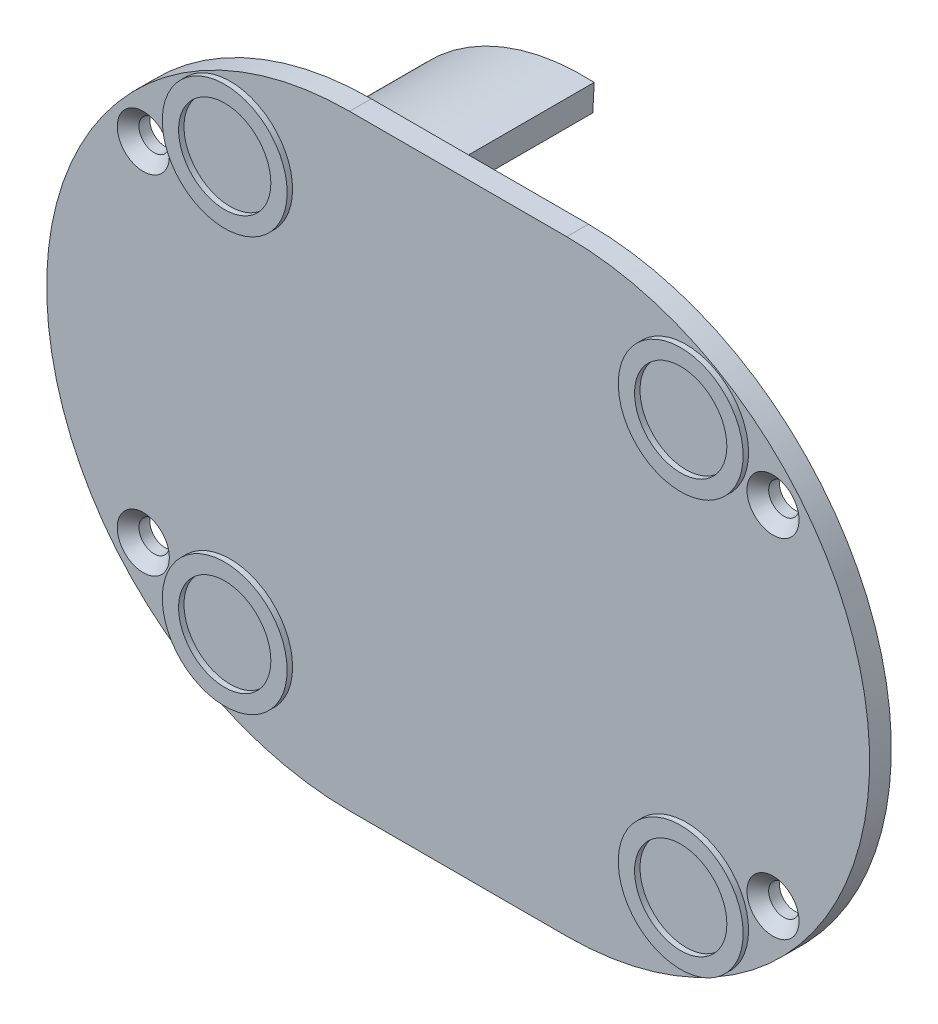
ISO-10303-21;
HEADER;
FILE_DESCRIPTION(('STEP AP214'),'2;1');
FILE_NAME('part.step','',(''),(''),'','','');
FILE_SCHEMA(('AUTOMOTIVE_DESIGN { 1 0 10303 214 1 1 1 1 }'));
ENDSEC;
DATA;
#1=APPLICATION_CONTEXT('core data for automotive mechanical design processes');
#2=APPLICATION_PROTOCOL_DEFINITION('international standard','automotive_design',2000,#1);
#3=PRODUCT_CONTEXT('',#1,'mechanical');
#4=PRODUCT('Part','Part','',(#3));
#5=PRODUCT_RELATED_PRODUCT_CATEGORY('part','',(#4));
#6=PRODUCT_DEFINITION_FORMATION('','',#4);
#7=PRODUCT_DEFINITION_CONTEXT('part definition',#1,'design');
#8=PRODUCT_DEFINITION('design','',#6,#7);
#9=PRODUCT_DEFINITION_SHAPE('','',#8);
#10=(LENGTH_UNIT() NAMED_UNIT(*) SI_UNIT(.MILLI.,.METRE.));
#11=(NAMED_UNIT(*) PLANE_ANGLE_UNIT() SI_UNIT($,.RADIAN.));
#12=(NAMED_UNIT(*) SI_UNIT($,.STERADIAN.) SOLID_ANGLE_UNIT());
#13=UNCERTAINTY_MEASURE_WITH_UNIT(LENGTH_MEASURE(1.E-05),#10,'distance_accuracy_value','');
#14=(GEOMETRIC_REPRESENTATION_CONTEXT(3) GLOBAL_UNCERTAINTY_ASSIGNED_CONTEXT((#13)) GLOBAL_UNIT_ASSIGNED_CONTEXT((#10,
#11,#12)) REPRESENTATION_CONTEXT('',''));
#15=CARTESIAN_POINT('',(0.,0.,0.));
#16=DIRECTION('',(0.,0.,1.));
#17=DIRECTION('',(1.,0.,0.));
#18=AXIS2_PLACEMENT_3D('',#15,#16,#17);
#19=CARTESIAN_POINT('',(-20.,0.,2.));
#20=DIRECTION('',(0.,0.,-1.));
#21=DIRECTION('',(-1.,0.,0.));
#22=AXIS2_PLACEMENT_3D('',#19,#20,#21);
#23=CYLINDRICAL_SURFACE('',#22,27.9);
#24=CARTESIAN_POINT('',(-20.,0.,0.));
#25=DIRECTION('',(0.,0.,1.));
#26=DIRECTION('',(1.,0.,0.));
#27=AXIS2_PLACEMENT_3D('',#24,#25,#26);
#28=CIRCLE('',#27,27.9);
#29=CARTESIAN_POINT('',(-20.,27.9,0.));
#30=VERTEX_POINT('',#29);
#31=CARTESIAN_POINT('',(-20.,-27.9,0.));
#32=VERTEX_POINT('',#31);
#33=EDGE_CURVE('E247',#30,#32,#28,.T.);
#34=ORIENTED_EDGE('',*,*,#33,.T.);
#35=DIRECTION('',(0.,0.,-1.));
#36=VECTOR('',#35,1.);
#37=CARTESIAN_POINT('',(-20.,-27.9,2.));
#38=LINE('',#37,#36);
#39=CARTESIAN_POINT('',(-20.,-27.9,2.));
#40=VERTEX_POINT('',#39);
#41=EDGE_CURVE('E263',#40,#32,#38,.T.);
#42=ORIENTED_EDGE('',*,*,#41,.F.);
#43=CARTESIAN_POINT('',(-20.,0.,2.));
#44=DIRECTION('',(0.,0.,1.));
#45=DIRECTION('',(1.,0.,0.));
#46=AXIS2_PLACEMENT_3D('',#43,#44,#45);
#47=CIRCLE('',#46,27.9);
#48=CARTESIAN_POINT('',(-20.,27.9,2.));
#49=VERTEX_POINT('',#48);
#50=EDGE_CURVE('E236',#49,#40,#47,.T.);
#51=ORIENTED_EDGE('',*,*,#50,.F.);
#52=DIRECTION('',(0.,0.,-1.));
#53=VECTOR('',#52,1.);
#54=CARTESIAN_POINT('',(-20.,27.9,2.));
#55=LINE('',#54,#53);
#56=EDGE_CURVE('E246',#49,#30,#55,.T.);
#57=ORIENTED_EDGE('',*,*,#56,.T.);
#58=EDGE_LOOP('',(#34,#42,#51,#57));
#59=FACE_BOUND('',#58,.T.);
#60=ADVANCED_FACE('F61',(#59),#23,.T.);
#61=CARTESIAN_POINT('',(-20.,-27.9,2.));
#62=DIRECTION('',(0.,1.,0.));
#63=DIRECTION('',(0.,0.,1.));
#64=AXIS2_PLACEMENT_3D('',#61,#62,#63);
#65=PLANE('',#64);
#66=DIRECTION('',(1.,0.,0.));
#67=VECTOR('',#66,1.);
#68=CARTESIAN_POINT('',(-20.,-27.9,0.));
#69=LINE('',#68,#67);
#70=CARTESIAN_POINT('',(0.,-27.9,0.));
#71=VERTEX_POINT('',#70);
#72=EDGE_CURVE('E250',#32,#71,#69,.T.);
#73=ORIENTED_EDGE('',*,*,#72,.T.);
#74=DIRECTION('',(0.,0.,-1.));
#75=VECTOR('',#74,1.);
#76=CARTESIAN_POINT('',(0.,-27.9,2.));
#77=LINE('',#76,#75);
#78=CARTESIAN_POINT('',(0.,-27.9,2.));
#79=VERTEX_POINT('',#78);
#80=EDGE_CURVE('E260',#79,#71,#77,.T.);
#81=ORIENTED_EDGE('',*,*,#80,.F.);
#82=DIRECTION('',(1.,0.,0.));
#83=VECTOR('',#82,1.);
#84=CARTESIAN_POINT('',(-20.,-27.9,2.));
#85=LINE('',#84,#83);
#86=EDGE_CURVE('E239',#40,#79,#85,.T.);
#87=ORIENTED_EDGE('',*,*,#86,.F.);
#88=ORIENTED_EDGE('',*,*,#41,.T.);
#89=EDGE_LOOP('',(#73,#81,#87,#88));
#90=FACE_BOUND('',#89,.T.);
#91=ADVANCED_FACE('F322',(#90),#65,.F.);
#92=CARTESIAN_POINT('',(0.,0.,2.));
#93=DIRECTION('',(0.,0.,-1.));
#94=DIRECTION('',(-1.,0.,0.));
#95=AXIS2_PLACEMENT_3D('',#92,#93,#94);
#96=CYLINDRICAL_SURFACE('',#95,27.9);
#97=CARTESIAN_POINT('',(0.,0.,0.));
#98=DIRECTION('',(0.,0.,1.));
#99=DIRECTION('',(1.,0.,0.));
#100=AXIS2_PLACEMENT_3D('',#97,#98,#99);
#101=CIRCLE('',#100,27.9);
#102=CARTESIAN_POINT('',(0.,27.9,0.));
#103=VERTEX_POINT('',#102);
#104=EDGE_CURVE('E252',#71,#103,#101,.T.);
#105=ORIENTED_EDGE('',*,*,#104,.T.);
#106=DIRECTION('',(0.,0.,-1.));
#107=VECTOR('',#106,1.);
#108=CARTESIAN_POINT('',(0.,27.9,2.));
#109=LINE('',#108,#107);
#110=CARTESIAN_POINT('',(0.,27.9,2.));
#111=VERTEX_POINT('',#110);
#112=EDGE_CURVE('E257',#111,#103,#109,.T.);
#113=ORIENTED_EDGE('',*,*,#112,.F.);
#114=CARTESIAN_POINT('',(0.,0.,2.));
#115=DIRECTION('',(0.,0.,1.));
#116=DIRECTION('',(1.,0.,0.));
#117=AXIS2_PLACEMENT_3D('',#114,#115,#116);
#118=CIRCLE('',#117,27.9);
#119=EDGE_CURVE('E242',#79,#111,#118,.T.);
#120=ORIENTED_EDGE('',*,*,#119,.F.);
#121=ORIENTED_EDGE('',*,*,#80,.T.);
#122=EDGE_LOOP('',(#105,#113,#120,#121));
#123=FACE_BOUND('',#122,.T.);
#124=ADVANCED_FACE('F328',(#123),#96,.T.);
#125=CARTESIAN_POINT('',(0.,27.9,2.));
#126=DIRECTION('',(0.,-1.,0.));
#127=DIRECTION('',(0.,0.,-1.));
#128=AXIS2_PLACEMENT_3D('',#125,#126,#127);
#129=PLANE('',#128);
#130=DIRECTION('',(-1.,0.,0.));
#131=VECTOR('',#130,1.);
#132=CARTESIAN_POINT('',(0.,27.9,0.));
#133=LINE('',#132,#131);
#134=EDGE_CURVE('E240',#103,#30,#133,.T.);
#135=ORIENTED_EDGE('',*,*,#134,.T.);
#136=ORIENTED_EDGE('',*,*,#56,.F.);
#137=DIRECTION('',(-1.,0.,0.));
#138=VECTOR('',#137,1.);
#139=CARTESIAN_POINT('',(0.,27.9,2.));
#140=LINE('',#139,#138);
#141=EDGE_CURVE('E244',#111,#49,#140,.T.);
#142=ORIENTED_EDGE('',*,*,#141,.F.);
#143=ORIENTED_EDGE('',*,*,#112,.T.);
#144=EDGE_LOOP('',(#135,#136,#142,#143));
#145=FACE_BOUND('',#144,.T.);
#146=ADVANCED_FACE('F594',(#145),#129,.F.);
#147=CARTESIAN_POINT('',(-20.,0.,2.));
#148=DIRECTION('',(0.,0.,1.));
#149=DIRECTION('',(1.,0.,0.));
#150=AXIS2_PLACEMENT_3D('',#147,#148,#149);
#151=PLANE('',#150);
#152=CARTESIAN_POINT('',(-31.0000000000001,19.0525588832576,2.));
#153=DIRECTION('',(0.,0.,1.));
#154=DIRECTION('',(1.,0.,0.));
#155=AXIS2_PLACEMENT_3D('',#152,#153,#154);
#156=CIRCLE('',#155,5.75);
#157=CARTESIAN_POINT('',(-25.2500000000001,19.0525588832576,2.));
#158=VERTEX_POINT('',#157);
#159=EDGE_CURVE('E184',#158,#158,#156,.T.);
#160=ORIENTED_EDGE('',*,*,#159,.F.);
#161=EDGE_LOOP('',(#160));
#162=FACE_BOUND('',#161,.T.);
#163=CARTESIAN_POINT('',(-31.0000000000001,-19.0525588832576,2.));
#164=DIRECTION('',(0.,0.,1.));
#165=DIRECTION('',(1.,0.,0.));
#166=AXIS2_PLACEMENT_3D('',#163,#164,#165);
#167=CIRCLE('',#166,5.75);
#168=CARTESIAN_POINT('',(-25.2500000000001,-19.0525588832576,2.));
#169=VERTEX_POINT('',#168);
#170=EDGE_CURVE('E175',#169,#169,#167,.T.);
#171=ORIENTED_EDGE('',*,*,#170,.F.);
#172=EDGE_LOOP('',(#171));
#173=FACE_BOUND('',#172,.T.);
#174=CARTESIAN_POINT('',(11.,19.0525588832577,2.));
#175=DIRECTION('',(0.,0.,1.));
#176=DIRECTION('',(1.,0.,0.));
#177=AXIS2_PLACEMENT_3D('',#174,#175,#176);
#178=CIRCLE('',#177,5.75);
#179=CARTESIAN_POINT('',(16.75,19.0525588832577,2.));
#180=VERTEX_POINT('',#179);
#181=EDGE_CURVE('E193',#180,#180,#178,.T.);
#182=ORIENTED_EDGE('',*,*,#181,.F.);
#183=EDGE_LOOP('',(#182));
#184=FACE_BOUND('',#183,.T.);
#185=CARTESIAN_POINT('',(11.,-19.0525588832577,2.));
#186=DIRECTION('',(0.,0.,1.));
#187=DIRECTION('',(1.,0.,0.));
#188=AXIS2_PLACEMENT_3D('',#185,#186,#187);
#189=CIRCLE('',#188,5.75);
#190=CARTESIAN_POINT('',(16.75,-19.0525588832577,2.));
#191=VERTEX_POINT('',#190);
#192=EDGE_CURVE('E202',#191,#191,#189,.T.);
#193=ORIENTED_EDGE('',*,*,#192,.F.);
#194=EDGE_LOOP('',(#193));
#195=FACE_BOUND('',#194,.T.);
#196=CARTESIAN_POINT('',(19.,-16.,2.));
#197=DIRECTION('',(0.,0.,1.));
#198=DIRECTION('',(1.,0.,0.));
#199=AXIS2_PLACEMENT_3D('',#196,#197,#198);
#200=CIRCLE('',#199,2.4);
#201=CARTESIAN_POINT('',(21.4,-16.,2.));
#202=VERTEX_POINT('',#201);
#203=EDGE_CURVE('E206',#202,#202,#200,.T.);
#204=ORIENTED_EDGE('',*,*,#203,.F.);
#205=EDGE_LOOP('',(#204));
#206=FACE_BOUND('',#205,.T.);
#207=CARTESIAN_POINT('',(19.,16.,2.));
#208=DIRECTION('',(0.,0.,1.));
#209=DIRECTION('',(1.,0.,0.));
#210=AXIS2_PLACEMENT_3D('',#207,#208,#209);
#211=CIRCLE('',#210,2.4);
#212=CARTESIAN_POINT('',(21.4,16.,2.));
#213=VERTEX_POINT('',#212);
#214=EDGE_CURVE('E215',#213,#213,#211,.T.);
#215=ORIENTED_EDGE('',*,*,#214,.F.);
#216=EDGE_LOOP('',(#215));
#217=FACE_BOUND('',#216,.T.);
#218=CARTESIAN_POINT('',(-39.,-16.,2.));
#219=DIRECTION('',(0.,0.,1.));
#220=DIRECTION('',(1.,0.,0.));
#221=AXIS2_PLACEMENT_3D('',#218,#219,#220);
#222=CIRCLE('',#221,2.4);
#223=CARTESIAN_POINT('',(-36.6,-16.,2.));
#224=VERTEX_POINT('',#223);
#225=EDGE_CURVE('E222',#224,#224,#222,.T.);
#226=ORIENTED_EDGE('',*,*,#225,.F.);
#227=EDGE_LOOP('',(#226));
#228=FACE_BOUND('',#227,.T.);
#229=CARTESIAN_POINT('',(-39.,16.,2.));
#230=DIRECTION('',(0.,0.,1.));
#231=DIRECTION('',(1.,0.,0.));
#232=AXIS2_PLACEMENT_3D('',#229,#230,#231);
#233=CIRCLE('',#232,2.4);
#234=CARTESIAN_POINT('',(-36.6,16.,2.));
#235=VERTEX_POINT('',#234);
#236=EDGE_CURVE('E229',#235,#235,#233,.T.);
#237=ORIENTED_EDGE('',*,*,#236,.F.);
#238=EDGE_LOOP('',(#237));
#239=FACE_BOUND('',#238,.T.);
#240=ORIENTED_EDGE('',*,*,#50,.T.);
#241=ORIENTED_EDGE('',*,*,#86,.T.);
#242=ORIENTED_EDGE('',*,*,#119,.T.);
#243=ORIENTED_EDGE('',*,*,#141,.T.);
#244=EDGE_LOOP('',(#240,#241,#242,#243));
#245=FACE_BOUND('',#244,.T.);
#246=ADVANCED_FACE('F389',(#162,#173,#184,#195,#206,#217,#228,#239,#245),#151,.T.);
#247=CARTESIAN_POINT('',(-20.,0.,0.));
#248=DIRECTION('',(0.,0.,1.));
#249=DIRECTION('',(1.,0.,0.));
#250=AXIS2_PLACEMENT_3D('',#247,#248,#249);
#251=PLANE('',#250);
#252=CARTESIAN_POINT('',(-20.,0.,0.));
#253=DIRECTION('',(0.,0.,1.));
#254=DIRECTION('',(1.,0.,0.));
#255=AXIS2_PLACEMENT_3D('',#252,#253,#254);
#256=CIRCLE('',#255,15.5);
#257=CARTESIAN_POINT('',(-34.6737330972949,4.99315100806604,0.));
#258=VERTEX_POINT('',#257);
#259=CARTESIAN_POINT('',(-19.2011295455593,15.4793994068575,0.));
#260=VERTEX_POINT('',#259);
#261=EDGE_CURVE('E293',#258,#260,#256,.F.);
#262=ORIENTED_EDGE('',*,*,#261,.T.);
#263=DIRECTION('',(-0.0515400293187571,-0.99867092947468,0.));
#264=VECTOR('',#263,1.);
#265=CARTESIAN_POINT('',(-20.,0.,0.));
#266=LINE('',#265,#264);
#267=CARTESIAN_POINT('',(-18.8661193549873,21.9707604484429,0.));
#268=VERTEX_POINT('',#267);
#269=EDGE_CURVE('E286',#268,#260,#266,.T.);
#270=ORIENTED_EDGE('',*,*,#269,.F.);
#271=CARTESIAN_POINT('',(-20.,0.,0.));
#272=DIRECTION('',(0.,0.,1.));
#273=DIRECTION('',(1.,0.,0.));
#274=AXIS2_PLACEMENT_3D('',#271,#272,#273);
#275=CIRCLE('',#274,22.);
#276=CARTESIAN_POINT('',(-40.8272340735799,7.08705304370663,0.));
#277=VERTEX_POINT('',#276);
#278=EDGE_CURVE('E290',#268,#277,#275,.T.);
#279=ORIENTED_EDGE('',*,*,#278,.T.);
#280=DIRECTION('',(-0.946692457889997,0.322138774713938,0.));
#281=VECTOR('',#280,1.);
#282=CARTESIAN_POINT('',(-20.,0.,0.));
#283=LINE('',#282,#281);
#284=EDGE_CURVE('E288',#258,#277,#283,.T.);
#285=ORIENTED_EDGE('',*,*,#284,.F.);
#286=EDGE_LOOP('',(#262,#270,#279,#285));
#287=FACE_BOUND('',#286,.T.);
#288=CARTESIAN_POINT('',(19.,-16.,0.));
#289=DIRECTION('',(0.,0.,1.));
#290=DIRECTION('',(1.,0.,0.));
#291=AXIS2_PLACEMENT_3D('',#288,#289,#290);
#292=CIRCLE('',#291,1.4);
#293=CARTESIAN_POINT('',(20.4,-16.,0.));
#294=VERTEX_POINT('',#293);
#295=EDGE_CURVE('E214',#294,#294,#292,.T.);
#296=ORIENTED_EDGE('',*,*,#295,.T.);
#297=EDGE_LOOP('',(#296));
#298=FACE_BOUND('',#297,.T.);
#299=CARTESIAN_POINT('',(19.,16.,0.));
#300=DIRECTION('',(0.,0.,1.));
#301=DIRECTION('',(1.,0.,0.));
#302=AXIS2_PLACEMENT_3D('',#299,#300,#301);
#303=CIRCLE('',#302,1.4);
#304=CARTESIAN_POINT('',(20.4,16.,0.));
#305=VERTEX_POINT('',#304);
#306=EDGE_CURVE('E221',#305,#305,#303,.T.);
#307=ORIENTED_EDGE('',*,*,#306,.T.);
#308=EDGE_LOOP('',(#307));
#309=FACE_BOUND('',#308,.T.);
#310=CARTESIAN_POINT('',(-39.,-16.,0.));
#311=DIRECTION('',(0.,0.,1.));
#312=DIRECTION('',(1.,0.,0.));
#313=AXIS2_PLACEMENT_3D('',#310,#311,#312);
#314=CIRCLE('',#313,1.4);
#315=CARTESIAN_POINT('',(-37.6,-16.,0.));
#316=VERTEX_POINT('',#315);
#317=EDGE_CURVE('E228',#316,#316,#314,.T.);
#318=ORIENTED_EDGE('',*,*,#317,.T.);
#319=EDGE_LOOP('',(#318));
#320=FACE_BOUND('',#319,.T.);
#321=CARTESIAN_POINT('',(-39.,16.,0.));
#322=DIRECTION('',(0.,0.,1.));
#323=DIRECTION('',(1.,0.,0.));
#324=AXIS2_PLACEMENT_3D('',#321,#322,#323);
#325=CIRCLE('',#324,1.4);
#326=CARTESIAN_POINT('',(-37.6,16.,0.));
#327=VERTEX_POINT('',#326);
#328=EDGE_CURVE('E235',#327,#327,#325,.T.);
#329=ORIENTED_EDGE('',*,*,#328,.T.);
#330=EDGE_LOOP('',(#329));
#331=FACE_BOUND('',#330,.T.);
#332=ORIENTED_EDGE('',*,*,#33,.F.);
#333=ORIENTED_EDGE('',*,*,#134,.F.);
#334=ORIENTED_EDGE('',*,*,#104,.F.);
#335=ORIENTED_EDGE('',*,*,#72,.F.);
#336=EDGE_LOOP('',(#332,#333,#334,#335));
#337=FACE_BOUND('',#336,.T.);
#338=ADVANCED_FACE('F304',(#287,#298,#309,#320,#331,#337),#251,.F.);
#339=CARTESIAN_POINT('',(-39.,16.,2.));
#340=DIRECTION('',(0.,0.,1.));
#341=DIRECTION('',(1.,0.,0.));
#342=AXIS2_PLACEMENT_3D('',#339,#340,#341);
#343=CYLINDRICAL_SURFACE('',#342,1.4);
#344=CARTESIAN_POINT('',(-39.,16.,1.));
#345=DIRECTION('',(0.,0.,1.));
#346=DIRECTION('',(1.,0.,0.));
#347=AXIS2_PLACEMENT_3D('',#344,#345,#346);
#348=CIRCLE('',#347,1.4);
#349=CARTESIAN_POINT('',(-37.6,16.,1.));
#350=VERTEX_POINT('',#349);
#351=EDGE_CURVE('E232',#350,#350,#348,.T.);
#352=ORIENTED_EDGE('',*,*,#351,.T.);
#353=EDGE_LOOP('',(#352));
#354=FACE_BOUND('',#353,.T.);
#355=ORIENTED_EDGE('',*,*,#328,.F.);
#356=EDGE_LOOP('',(#355));
#357=FACE_BOUND('',#356,.T.);
#358=ADVANCED_FACE('F388',(#354,#357),#343,.F.);
#359=CARTESIAN_POINT('',(-39.,16.,2.));
#360=DIRECTION('',(0.,0.,1.));
#361=DIRECTION('',(1.,0.,0.));
#362=AXIS2_PLACEMENT_3D('',#359,#360,#361);
#363=CONICAL_SURFACE('',#362,2.4,0.785398163397449);
#364=ORIENTED_EDGE('',*,*,#351,.F.);
#365=EDGE_LOOP('',(#364));
#366=FACE_BOUND('',#365,.T.);
#367=ORIENTED_EDGE('',*,*,#236,.T.);
#368=EDGE_LOOP('',(#367));
#369=FACE_BOUND('',#368,.T.);
#370=ADVANCED_FACE('F405',(#366,#369),#363,.F.);
#371=CARTESIAN_POINT('',(-39.,-16.,2.));
#372=DIRECTION('',(0.,0.,1.));
#373=DIRECTION('',(1.,0.,0.));
#374=AXIS2_PLACEMENT_3D('',#371,#372,#373);
#375=CYLINDRICAL_SURFACE('',#374,1.4);
#376=CARTESIAN_POINT('',(-39.,-16.,1.));
#377=DIRECTION('',(0.,0.,1.));
#378=DIRECTION('',(1.,0.,0.));
#379=AXIS2_PLACEMENT_3D('',#376,#377,#378);
#380=CIRCLE('',#379,1.4);
#381=CARTESIAN_POINT('',(-37.6,-16.,1.));
#382=VERTEX_POINT('',#381);
#383=EDGE_CURVE('E225',#382,#382,#380,.T.);
#384=ORIENTED_EDGE('',*,*,#383,.T.);
#385=EDGE_LOOP('',(#384));
#386=FACE_BOUND('',#385,.T.);
#387=ORIENTED_EDGE('',*,*,#317,.F.);
#388=EDGE_LOOP('',(#387));
#389=FACE_BOUND('',#388,.T.);
#390=ADVANCED_FACE('F413',(#386,#389),#375,.F.);
#391=CARTESIAN_POINT('',(-39.,-16.,2.));
#392=DIRECTION('',(0.,0.,1.));
#393=DIRECTION('',(1.,0.,0.));
#394=AXIS2_PLACEMENT_3D('',#391,#392,#393);
#395=CONICAL_SURFACE('',#394,2.4,0.785398163397449);
#396=ORIENTED_EDGE('',*,*,#383,.F.);
#397=EDGE_LOOP('',(#396));
#398=FACE_BOUND('',#397,.T.);
#399=ORIENTED_EDGE('',*,*,#225,.T.);
#400=EDGE_LOOP('',(#399));
#401=FACE_BOUND('',#400,.T.);
#402=ADVANCED_FACE('F421',(#398,#401),#395,.F.);
#403=CARTESIAN_POINT('',(19.,16.,2.));
#404=DIRECTION('',(0.,0.,1.));
#405=DIRECTION('',(1.,0.,0.));
#406=AXIS2_PLACEMENT_3D('',#403,#404,#405);
#407=CYLINDRICAL_SURFACE('',#406,1.4);
#408=CARTESIAN_POINT('',(19.,16.,1.));
#409=DIRECTION('',(0.,0.,1.));
#410=DIRECTION('',(1.,0.,0.));
#411=AXIS2_PLACEMENT_3D('',#408,#409,#410);
#412=CIRCLE('',#411,1.4);
#413=CARTESIAN_POINT('',(20.4,16.,1.));
#414=VERTEX_POINT('',#413);
#415=EDGE_CURVE('E218',#414,#414,#412,.T.);
#416=ORIENTED_EDGE('',*,*,#415,.T.);
#417=EDGE_LOOP('',(#416));
#418=FACE_BOUND('',#417,.T.);
#419=ORIENTED_EDGE('',*,*,#306,.F.);
#420=EDGE_LOOP('',(#419));
#421=FACE_BOUND('',#420,.T.);
#422=ADVANCED_FACE('F429',(#418,#421),#407,.F.);
#423=CARTESIAN_POINT('',(19.,16.,2.));
#424=DIRECTION('',(0.,0.,1.));
#425=DIRECTION('',(1.,0.,0.));
#426=AXIS2_PLACEMENT_3D('',#423,#424,#425);
#427=CONICAL_SURFACE('',#426,2.4,0.785398163397449);
#428=ORIENTED_EDGE('',*,*,#415,.F.);
#429=EDGE_LOOP('',(#428));
#430=FACE_BOUND('',#429,.T.);
#431=ORIENTED_EDGE('',*,*,#214,.T.);
#432=EDGE_LOOP('',(#431));
#433=FACE_BOUND('',#432,.T.);
#434=ADVANCED_FACE('F437',(#430,#433),#427,.F.);
#435=CARTESIAN_POINT('',(19.,-16.,2.));
#436=DIRECTION('',(0.,0.,1.));
#437=DIRECTION('',(1.,0.,0.));
#438=AXIS2_PLACEMENT_3D('',#435,#436,#437);
#439=CYLINDRICAL_SURFACE('',#438,1.4);
#440=CARTESIAN_POINT('',(19.,-16.,1.));
#441=DIRECTION('',(0.,0.,1.));
#442=DIRECTION('',(1.,0.,0.));
#443=AXIS2_PLACEMENT_3D('',#440,#441,#442);
#444=CIRCLE('',#443,1.4);
#445=CARTESIAN_POINT('',(20.4,-16.,1.));
#446=VERTEX_POINT('',#445);
#447=EDGE_CURVE('E211',#446,#446,#444,.T.);
#448=ORIENTED_EDGE('',*,*,#447,.T.);
#449=EDGE_LOOP('',(#448));
#450=FACE_BOUND('',#449,.T.);
#451=ORIENTED_EDGE('',*,*,#295,.F.);
#452=EDGE_LOOP('',(#451));
#453=FACE_BOUND('',#452,.T.);
#454=ADVANCED_FACE('F445',(#450,#453),#439,.F.);
#455=CARTESIAN_POINT('',(19.,-16.,2.));
#456=DIRECTION('',(0.,0.,1.));
#457=DIRECTION('',(1.,0.,0.));
#458=AXIS2_PLACEMENT_3D('',#455,#456,#457);
#459=CONICAL_SURFACE('',#458,2.4,0.785398163397449);
#460=ORIENTED_EDGE('',*,*,#447,.F.);
#461=EDGE_LOOP('',(#460));
#462=FACE_BOUND('',#461,.T.);
#463=ORIENTED_EDGE('',*,*,#203,.T.);
#464=EDGE_LOOP('',(#463));
#465=FACE_BOUND('',#464,.T.);
#466=ADVANCED_FACE('F453',(#462,#465),#459,.F.);
#467=CARTESIAN_POINT('',(11.,-19.0525588832577,2.5));
#468=DIRECTION('',(0.,0.,1.));
#469=DIRECTION('',(1.,0.,0.));
#470=AXIS2_PLACEMENT_3D('',#467,#468,#469);
#471=PLANE('',#470);
#472=CARTESIAN_POINT('',(11.,-19.0525588832577,2.5));
#473=DIRECTION('',(0.,0.,1.));
#474=DIRECTION('',(1.,0.,0.));
#475=AXIS2_PLACEMENT_3D('',#472,#473,#474);
#476=CIRCLE('',#475,5.75);
#477=CARTESIAN_POINT('',(16.75,-19.0525588832577,2.5));
#478=VERTEX_POINT('',#477);
#479=EDGE_CURVE('E203',#478,#478,#476,.T.);
#480=ORIENTED_EDGE('',*,*,#479,.T.);
#481=EDGE_LOOP('',(#480));
#482=FACE_BOUND('',#481,.T.);
#483=CARTESIAN_POINT('',(11.,-19.0525588832577,2.5));
#484=DIRECTION('',(0.,0.,1.));
#485=DIRECTION('',(1.,0.,0.));
#486=AXIS2_PLACEMENT_3D('',#483,#484,#485);
#487=CIRCLE('',#486,4.25);
#488=CARTESIAN_POINT('',(15.25,-19.0525588832577,2.5));
#489=VERTEX_POINT('',#488);
#490=EDGE_CURVE('E197',#489,#489,#487,.T.);
#491=ORIENTED_EDGE('',*,*,#490,.F.);
#492=EDGE_LOOP('',(#491));
#493=FACE_BOUND('',#492,.T.);
#494=ADVANCED_FACE('F461',(#482,#493),#471,.T.);
#495=CARTESIAN_POINT('',(11.,-19.0525588832577,2.5));
#496=DIRECTION('',(0.,0.,-1.));
#497=DIRECTION('',(-1.,0.,0.));
#498=AXIS2_PLACEMENT_3D('',#495,#496,#497);
#499=CYLINDRICAL_SURFACE('',#498,5.75);
#500=ORIENTED_EDGE('',*,*,#479,.F.);
#501=EDGE_LOOP('',(#500));
#502=FACE_BOUND('',#501,.T.);
#503=ORIENTED_EDGE('',*,*,#192,.T.);
#504=EDGE_LOOP('',(#503));
#505=FACE_BOUND('',#504,.T.);
#506=ADVANCED_FACE('F469',(#502,#505),#499,.T.);
#507=CARTESIAN_POINT('',(11.,-19.0525588832577,2.5));
#508=DIRECTION('',(0.,0.,-1.));
#509=DIRECTION('',(-1.,0.,0.));
#510=AXIS2_PLACEMENT_3D('',#507,#508,#509);
#511=CYLINDRICAL_SURFACE('',#510,4.25);
#512=ORIENTED_EDGE('',*,*,#490,.T.);
#513=EDGE_LOOP('',(#512));
#514=FACE_BOUND('',#513,.T.);
#515=CARTESIAN_POINT('',(11.,-19.0525588832577,2.));
#516=DIRECTION('',(0.,0.,1.));
#517=DIRECTION('',(1.,0.,0.));
#518=AXIS2_PLACEMENT_3D('',#515,#516,#517);
#519=CIRCLE('',#518,4.25);
#520=CARTESIAN_POINT('',(15.25,-19.0525588832577,2.));
#521=VERTEX_POINT('',#520);
#522=EDGE_CURVE('E266',#521,#521,#519,.F.);
#523=ORIENTED_EDGE('',*,*,#522,.T.);
#524=EDGE_LOOP('',(#523));
#525=FACE_BOUND('',#524,.T.);
#526=ADVANCED_FACE('F477',(#514,#525),#511,.F.);
#527=ORIENTED_EDGE('',*,*,#522,.F.);
#528=EDGE_LOOP('',(#527));
#529=FACE_BOUND('',#528,.T.);
#530=ADVANCED_FACE('F485',(#529),#151,.T.);
#531=CARTESIAN_POINT('',(11.,19.0525588832577,2.5));
#532=DIRECTION('',(0.,0.,1.));
#533=DIRECTION('',(1.,0.,0.));
#534=AXIS2_PLACEMENT_3D('',#531,#532,#533);
#535=PLANE('',#534);
#536=CARTESIAN_POINT('',(11.,19.0525588832577,2.5));
#537=DIRECTION('',(0.,0.,1.));
#538=DIRECTION('',(1.,0.,0.));
#539=AXIS2_PLACEMENT_3D('',#536,#537,#538);
#540=CIRCLE('',#539,5.75);
#541=CARTESIAN_POINT('',(16.75,19.0525588832577,2.5));
#542=VERTEX_POINT('',#541);
#543=EDGE_CURVE('E194',#542,#542,#540,.T.);
#544=ORIENTED_EDGE('',*,*,#543,.T.);
#545=EDGE_LOOP('',(#544));
#546=FACE_BOUND('',#545,.T.);
#547=CARTESIAN_POINT('',(11.,19.0525588832577,2.5));
#548=DIRECTION('',(0.,0.,1.));
#549=DIRECTION('',(1.,0.,0.));
#550=AXIS2_PLACEMENT_3D('',#547,#548,#549);
#551=CIRCLE('',#550,4.25);
#552=CARTESIAN_POINT('',(15.25,19.0525588832577,2.5));
#553=VERTEX_POINT('',#552);
#554=EDGE_CURVE('E188',#553,#553,#551,.T.);
#555=ORIENTED_EDGE('',*,*,#554,.F.);
#556=EDGE_LOOP('',(#555));
#557=FACE_BOUND('',#556,.T.);
#558=ADVANCED_FACE('F493',(#546,#557),#535,.T.);
#559=CARTESIAN_POINT('',(11.,19.0525588832577,2.5));
#560=DIRECTION('',(0.,0.,-1.));
#561=DIRECTION('',(-1.,0.,0.));
#562=AXIS2_PLACEMENT_3D('',#559,#560,#561);
#563=CYLINDRICAL_SURFACE('',#562,5.75);
#564=ORIENTED_EDGE('',*,*,#543,.F.);
#565=EDGE_LOOP('',(#564));
#566=FACE_BOUND('',#565,.T.);
#567=ORIENTED_EDGE('',*,*,#181,.T.);
#568=EDGE_LOOP('',(#567));
#569=FACE_BOUND('',#568,.T.);
#570=ADVANCED_FACE('F502',(#566,#569),#563,.T.);
#571=CARTESIAN_POINT('',(11.,19.0525588832577,2.5));
#572=DIRECTION('',(0.,0.,-1.));
#573=DIRECTION('',(-1.,0.,0.));
#574=AXIS2_PLACEMENT_3D('',#571,#572,#573);
#575=CYLINDRICAL_SURFACE('',#574,4.25);
#576=ORIENTED_EDGE('',*,*,#554,.T.);
#577=EDGE_LOOP('',(#576));
#578=FACE_BOUND('',#577,.T.);
#579=CARTESIAN_POINT('',(11.,19.0525588832577,2.));
#580=DIRECTION('',(0.,0.,1.));
#581=DIRECTION('',(1.,0.,0.));
#582=AXIS2_PLACEMENT_3D('',#579,#580,#581);
#583=CIRCLE('',#582,4.25);
#584=CARTESIAN_POINT('',(15.25,19.0525588832577,2.));
#585=VERTEX_POINT('',#584);
#586=EDGE_CURVE('E277',#585,#585,#583,.F.);
#587=ORIENTED_EDGE('',*,*,#586,.T.);
#588=EDGE_LOOP('',(#587));
#589=FACE_BOUND('',#588,.T.);
#590=ADVANCED_FACE('F510',(#578,#589),#575,.F.);
#591=ORIENTED_EDGE('',*,*,#586,.F.);
#592=EDGE_LOOP('',(#591));
#593=FACE_BOUND('',#592,.T.);
#594=ADVANCED_FACE('F496',(#593),#151,.T.);
#595=CARTESIAN_POINT('',(-31.0000000000001,19.0525588832576,2.5));
#596=DIRECTION('',(0.,0.,1.));
#597=DIRECTION('',(1.,0.,0.));
#598=AXIS2_PLACEMENT_3D('',#595,#596,#597);
#599=PLANE('',#598);
#600=CARTESIAN_POINT('',(-31.0000000000001,19.0525588832576,2.5));
#601=DIRECTION('',(0.,0.,1.));
#602=DIRECTION('',(1.,0.,0.));
#603=AXIS2_PLACEMENT_3D('',#600,#601,#602);
#604=CIRCLE('',#603,5.75);
#605=CARTESIAN_POINT('',(-25.2500000000001,19.0525588832576,2.5));
#606=VERTEX_POINT('',#605);
#607=EDGE_CURVE('E185',#606,#606,#604,.T.);
#608=ORIENTED_EDGE('',*,*,#607,.T.);
#609=EDGE_LOOP('',(#608));
#610=FACE_BOUND('',#609,.T.);
#611=CARTESIAN_POINT('',(-31.0000000000001,19.0525588832576,2.5));
#612=DIRECTION('',(0.,0.,1.));
#613=DIRECTION('',(1.,0.,0.));
#614=AXIS2_PLACEMENT_3D('',#611,#612,#613);
#615=CIRCLE('',#614,4.25);
#616=CARTESIAN_POINT('',(-26.7500000000001,19.0525588832576,2.5));
#617=VERTEX_POINT('',#616);
#618=EDGE_CURVE('E179',#617,#617,#615,.T.);
#619=ORIENTED_EDGE('',*,*,#618,.F.);
#620=EDGE_LOOP('',(#619));
#621=FACE_BOUND('',#620,.T.);
#622=ADVANCED_FACE('F525',(#610,#621),#599,.T.);
#623=CARTESIAN_POINT('',(-31.0000000000001,19.0525588832576,2.5));
#624=DIRECTION('',(0.,0.,-1.));
#625=DIRECTION('',(-1.,0.,0.));
#626=AXIS2_PLACEMENT_3D('',#623,#624,#625);
#627=CYLINDRICAL_SURFACE('',#626,5.75);
#628=ORIENTED_EDGE('',*,*,#607,.F.);
#629=EDGE_LOOP('',(#628));
#630=FACE_BOUND('',#629,.T.);
#631=ORIENTED_EDGE('',*,*,#159,.T.);
#632=EDGE_LOOP('',(#631));
#633=FACE_BOUND('',#632,.T.);
#634=ADVANCED_FACE('F533',(#630,#633),#627,.T.);
#635=CARTESIAN_POINT('',(-31.0000000000001,19.0525588832576,2.5));
#636=DIRECTION('',(0.,0.,-1.));
#637=DIRECTION('',(-1.,0.,0.));
#638=AXIS2_PLACEMENT_3D('',#635,#636,#637);
#639=CYLINDRICAL_SURFACE('',#638,4.25);
#640=ORIENTED_EDGE('',*,*,#618,.T.);
#641=EDGE_LOOP('',(#640));
#642=FACE_BOUND('',#641,.T.);
#643=CARTESIAN_POINT('',(-31.0000000000001,19.0525588832576,2.));
#644=DIRECTION('',(0.,0.,1.));
#645=DIRECTION('',(1.,0.,0.));
#646=AXIS2_PLACEMENT_3D('',#643,#644,#645);
#647=CIRCLE('',#646,4.25);
#648=CARTESIAN_POINT('',(-26.7500000000001,19.0525588832576,2.));
#649=VERTEX_POINT('',#648);
#650=EDGE_CURVE('E280',#649,#649,#647,.F.);
#651=ORIENTED_EDGE('',*,*,#650,.T.);
#652=EDGE_LOOP('',(#651));
#653=FACE_BOUND('',#652,.T.);
#654=ADVANCED_FACE('F543',(#642,#653),#639,.F.);
#655=ORIENTED_EDGE('',*,*,#650,.F.);
#656=EDGE_LOOP('',(#655));
#657=FACE_BOUND('',#656,.T.);
#658=ADVANCED_FACE('F527',(#657),#151,.T.);
#659=CARTESIAN_POINT('',(-31.0000000000001,-19.0525588832576,2.5));
#660=DIRECTION('',(0.,0.,1.));
#661=DIRECTION('',(1.,0.,0.));
#662=AXIS2_PLACEMENT_3D('',#659,#660,#661);
#663=PLANE('',#662);
#664=CARTESIAN_POINT('',(-31.0000000000001,-19.0525588832576,2.5));
#665=DIRECTION('',(0.,0.,1.));
#666=DIRECTION('',(1.,0.,0.));
#667=AXIS2_PLACEMENT_3D('',#664,#665,#666);
#668=CIRCLE('',#667,5.75);
#669=CARTESIAN_POINT('',(-25.2500000000001,-19.0525588832576,2.5));
#670=VERTEX_POINT('',#669);
#671=EDGE_CURVE('E176',#670,#670,#668,.T.);
#672=ORIENTED_EDGE('',*,*,#671,.T.);
#673=EDGE_LOOP('',(#672));
#674=FACE_BOUND('',#673,.T.);
#675=CARTESIAN_POINT('',(-31.0000000000001,-19.0525588832576,2.5));
#676=DIRECTION('',(0.,0.,1.));
#677=DIRECTION('',(1.,0.,0.));
#678=AXIS2_PLACEMENT_3D('',#675,#676,#677);
#679=CIRCLE('',#678,4.25);
#680=CARTESIAN_POINT('',(-26.7500000000001,-19.0525588832576,2.5));
#681=VERTEX_POINT('',#680);
#682=EDGE_CURVE('E169',#681,#681,#679,.T.);
#683=ORIENTED_EDGE('',*,*,#682,.F.);
#684=EDGE_LOOP('',(#683));
#685=FACE_BOUND('',#684,.T.);
#686=ADVANCED_FACE('F562',(#674,#685),#663,.T.);
#687=CARTESIAN_POINT('',(-31.0000000000001,-19.0525588832576,2.5));
#688=DIRECTION('',(0.,0.,-1.));
#689=DIRECTION('',(-1.,0.,0.));
#690=AXIS2_PLACEMENT_3D('',#687,#688,#689);
#691=CYLINDRICAL_SURFACE('',#690,5.75);
#692=ORIENTED_EDGE('',*,*,#671,.F.);
#693=EDGE_LOOP('',(#692));
#694=FACE_BOUND('',#693,.T.);
#695=ORIENTED_EDGE('',*,*,#170,.T.);
#696=EDGE_LOOP('',(#695));
#697=FACE_BOUND('',#696,.T.);
#698=ADVANCED_FACE('F570',(#694,#697),#691,.T.);
#699=CARTESIAN_POINT('',(-31.0000000000001,-19.0525588832576,2.5));
#700=DIRECTION('',(0.,0.,-1.));
#701=DIRECTION('',(-1.,0.,0.));
#702=AXIS2_PLACEMENT_3D('',#699,#700,#701);
#703=CYLINDRICAL_SURFACE('',#702,4.25);
#704=ORIENTED_EDGE('',*,*,#682,.T.);
#705=EDGE_LOOP('',(#704));
#706=FACE_BOUND('',#705,.T.);
#707=CARTESIAN_POINT('',(-31.0000000000001,-19.0525588832576,2.));
#708=DIRECTION('',(0.,0.,1.));
#709=DIRECTION('',(1.,0.,0.));
#710=AXIS2_PLACEMENT_3D('',#707,#708,#709);
#711=CIRCLE('',#710,4.25);
#712=CARTESIAN_POINT('',(-26.7500000000001,-19.0525588832576,2.));
#713=VERTEX_POINT('',#712);
#714=EDGE_CURVE('E283',#713,#713,#711,.F.);
#715=ORIENTED_EDGE('',*,*,#714,.T.);
#716=EDGE_LOOP('',(#715));
#717=FACE_BOUND('',#716,.T.);
#718=ADVANCED_FACE('F577',(#706,#717),#703,.F.);
#719=ORIENTED_EDGE('',*,*,#714,.F.);
#720=EDGE_LOOP('',(#719));
#721=FACE_BOUND('',#720,.T.);
#722=ADVANCED_FACE('F379',(#721),#151,.T.);
#723=CARTESIAN_POINT('',(-20.,0.,-19.5));
#724=DIRECTION('',(0.,0.,1.));
#725=DIRECTION('',(1.,0.,0.));
#726=AXIS2_PLACEMENT_3D('',#723,#724,#725);
#727=CYLINDRICAL_SURFACE('',#726,17.5);
#728=DIRECTION('',(0.,0.,1.));
#729=VECTOR('',#728,1.);
#730=CARTESIAN_POINT('',(-19.0980494869217,17.4767412658069,-19.5));
#731=LINE('',#730,#729);
#732=CARTESIAN_POINT('',(-19.0980494869217,17.4767412658069,-19.5));
#733=VERTEX_POINT('',#732);
#734=CARTESIAN_POINT('',(-19.0980494869217,17.4767412658069,-1.99999999999999));
#735=VERTEX_POINT('',#734);
#736=EDGE_CURVE('E151',#733,#735,#731,.T.);
#737=ORIENTED_EDGE('',*,*,#736,.T.);
#738=CARTESIAN_POINT('',(-20.,0.,-1.99999999999999));
#739=DIRECTION('',(0.,0.,1.));
#740=DIRECTION('',(1.,0.,0.));
#741=AXIS2_PLACEMENT_3D('',#738,#739,#740);
#742=CIRCLE('',#741,17.5);
#743=CARTESIAN_POINT('',(-36.5671180130749,5.63742855749389,-1.99999999999999));
#744=VERTEX_POINT('',#743);
#745=EDGE_CURVE('E296',#735,#744,#742,.T.);
#746=ORIENTED_EDGE('',*,*,#745,.T.);
#747=DIRECTION('',(0.,0.,1.));
#748=VECTOR('',#747,1.);
#749=CARTESIAN_POINT('',(-36.5671180130749,5.63742855749389,-19.5));
#750=LINE('',#749,#748);
#751=CARTESIAN_POINT('',(-36.5671180130749,5.63742855749389,-19.5));
#752=VERTEX_POINT('',#751);
#753=EDGE_CURVE('E162',#752,#744,#750,.T.);
#754=ORIENTED_EDGE('',*,*,#753,.F.);
#755=CARTESIAN_POINT('',(-20.,0.,-19.5));
#756=DIRECTION('',(0.,0.,1.));
#757=DIRECTION('',(1.,0.,0.));
#758=AXIS2_PLACEMENT_3D('',#755,#756,#757);
#759=CIRCLE('',#758,17.5);
#760=EDGE_CURVE('E143',#752,#733,#759,.F.);
#761=ORIENTED_EDGE('',*,*,#760,.T.);
#762=EDGE_LOOP('',(#737,#746,#754,#761));
#763=FACE_BOUND('',#762,.T.);
#764=ADVANCED_FACE('F160',(#763),#727,.F.);
#765=CARTESIAN_POINT('',(-36.5671180130749,5.63742855749389,-19.5));
#766=DIRECTION('',(0.322138774713938,0.946692457889996,0.));
#767=DIRECTION('',(-0.946692457889997,0.322138774713938,0.));
#768=AXIS2_PLACEMENT_3D('',#765,#766,#767);
#769=PLANE('',#768);
#770=ORIENTED_EDGE('',*,*,#753,.T.);
#771=DIRECTION('',(0.669412656672179,-0.227786512083352,0.707106781186545));
#772=VECTOR('',#771,1.);
#773=CARTESIAN_POINT('',(-20.,0.,15.4999999999999));
#774=LINE('',#773,#772);
#775=EDGE_CURVE('E301',#744,#258,#774,.T.);
#776=ORIENTED_EDGE('',*,*,#775,.T.);
#777=ORIENTED_EDGE('',*,*,#284,.T.);
#778=DIRECTION('',(-0.669412656672175,0.22778651208335,0.70710678118655));
#779=VECTOR('',#778,1.);
#780=CARTESIAN_POINT('',(-20.,0.,-22.0000000000001));
#781=LINE('',#780,#779);
#782=CARTESIAN_POINT('',(-38.9338491577999,6.44277549427874,-1.99999999999999));
#783=VERTEX_POINT('',#782);
#784=EDGE_CURVE('E12',#277,#783,#781,.F.);
#785=ORIENTED_EDGE('',*,*,#784,.T.);
#786=DIRECTION('',(0.,0.,1.));
#787=VECTOR('',#786,1.);
#788=CARTESIAN_POINT('',(-38.9338491577999,6.44277549427874,-19.5));
#789=LINE('',#788,#787);
#790=CARTESIAN_POINT('',(-38.9338491577999,6.44277549427874,-19.5));
#791=VERTEX_POINT('',#790);
#792=EDGE_CURVE('E170',#791,#783,#789,.T.);
#793=ORIENTED_EDGE('',*,*,#792,.F.);
#794=DIRECTION('',(-0.946692457889996,0.322138774713938,0.));
#795=VECTOR('',#794,1.);
#796=CARTESIAN_POINT('',(-36.5671180130749,5.63742855749389,-19.5));
#797=LINE('',#796,#795);
#798=EDGE_CURVE('E158',#752,#791,#797,.T.);
#799=ORIENTED_EDGE('',*,*,#798,.F.);
#800=EDGE_LOOP('',(#770,#776,#777,#785,#793,#799));
#801=FACE_BOUND('',#800,.T.);
#802=ADVANCED_FACE('F310',(#801),#769,.F.);
#803=CARTESIAN_POINT('',(-20.,0.,-19.5));
#804=DIRECTION('',(0.,0.,1.));
#805=DIRECTION('',(1.,0.,0.));
#806=AXIS2_PLACEMENT_3D('',#803,#804,#805);
#807=CYLINDRICAL_SURFACE('',#806,20.);
#808=ORIENTED_EDGE('',*,*,#792,.T.);
#809=CARTESIAN_POINT('',(-20.,0.,-1.99999999999999));
#810=DIRECTION('',(0.,0.,1.));
#811=DIRECTION('',(1.,0.,0.));
#812=AXIS2_PLACEMENT_3D('',#809,#810,#811);
#813=CIRCLE('',#812,20.);
#814=CARTESIAN_POINT('',(-18.9691994136249,19.9734185894936,-1.99999999999999));
#815=VERTEX_POINT('',#814);
#816=EDGE_CURVE('E298',#783,#815,#813,.F.);
#817=ORIENTED_EDGE('',*,*,#816,.T.);
#818=DIRECTION('',(0.,0.,1.));
#819=VECTOR('',#818,1.);
#820=CARTESIAN_POINT('',(-18.9691994136249,19.9734185894936,-19.5));
#821=LINE('',#820,#819);
#822=CARTESIAN_POINT('',(-18.9691994136249,19.9734185894936,-19.5));
#823=VERTEX_POINT('',#822);
#824=EDGE_CURVE('E157',#823,#815,#821,.T.);
#825=ORIENTED_EDGE('',*,*,#824,.F.);
#826=CARTESIAN_POINT('',(-20.,0.,-19.5));
#827=DIRECTION('',(0.,0.,-1.));
#828=DIRECTION('',(-1.,0.,0.));
#829=AXIS2_PLACEMENT_3D('',#826,#827,#828);
#830=CIRCLE('',#829,20.);
#831=EDGE_CURVE('E145',#791,#823,#830,.T.);
#832=ORIENTED_EDGE('',*,*,#831,.F.);
#833=EDGE_LOOP('',(#808,#817,#825,#832));
#834=FACE_BOUND('',#833,.T.);
#835=ADVANCED_FACE('F312',(#834),#807,.T.);
#836=CARTESIAN_POINT('',(-18.9691994136249,19.9734185894936,-19.5));
#837=DIRECTION('',(-0.99867092947468,0.0515400293187571,0.));
#838=DIRECTION('',(-0.0515400293187571,-0.99867092947468,0.));
#839=AXIS2_PLACEMENT_3D('',#836,#837,#838);
#840=PLANE('',#839);
#841=ORIENTED_EDGE('',*,*,#824,.T.);
#842=DIRECTION('',(-0.0364443042338465,-0.706166986405417,-0.70710678118655));
#843=VECTOR('',#842,1.);
#844=CARTESIAN_POINT('',(-20.,0.,-22.0000000000001));
#845=LINE('',#844,#843);
#846=EDGE_CURVE('E70',#815,#268,#845,.F.);
#847=ORIENTED_EDGE('',*,*,#846,.T.);
#848=ORIENTED_EDGE('',*,*,#269,.T.);
#849=DIRECTION('',(0.0364443042338468,0.706166986405422,-0.707106781186545));
#850=VECTOR('',#849,1.);
#851=CARTESIAN_POINT('',(-20.,0.,15.4999999999999));
#852=LINE('',#851,#850);
#853=EDGE_CURVE('E154',#260,#735,#852,.T.);
#854=ORIENTED_EDGE('',*,*,#853,.T.);
#855=ORIENTED_EDGE('',*,*,#736,.F.);
#856=DIRECTION('',(-0.0515400293187571,-0.99867092947468,0.));
#857=VECTOR('',#856,1.);
#858=CARTESIAN_POINT('',(-18.9691994136249,19.9734185894936,-19.5));
#859=LINE('',#858,#857);
#860=EDGE_CURVE('E139',#823,#733,#859,.T.);
#861=ORIENTED_EDGE('',*,*,#860,.F.);
#862=EDGE_LOOP('',(#841,#847,#848,#854,#855,#861));
#863=FACE_BOUND('',#862,.T.);
#864=ADVANCED_FACE('F152',(#863),#840,.F.);
#865=CARTESIAN_POINT('',(-20.,0.,-19.5));
#866=DIRECTION('',(0.,0.,1.));
#867=DIRECTION('',(1.,0.,0.));
#868=AXIS2_PLACEMENT_3D('',#865,#866,#867);
#869=PLANE('',#868);
#870=ORIENTED_EDGE('',*,*,#760,.F.);
#871=ORIENTED_EDGE('',*,*,#798,.T.);
#872=ORIENTED_EDGE('',*,*,#831,.T.);
#873=ORIENTED_EDGE('',*,*,#860,.T.);
#874=EDGE_LOOP('',(#870,#871,#872,#873));
#875=FACE_BOUND('',#874,.T.);
#876=ADVANCED_FACE('F141',(#875),#869,.F.);
#877=CARTESIAN_POINT('',(-20.,0.,0.));
#878=DIRECTION('',(0.,0.,-1.));
#879=DIRECTION('',(-1.,0.,0.));
#880=AXIS2_PLACEMENT_3D('',#877,#878,#879);
#881=CONICAL_SURFACE('',#880,15.5,0.785398163397452);
#882=ORIENTED_EDGE('',*,*,#775,.F.);
#883=ORIENTED_EDGE('',*,*,#745,.F.);
#884=ORIENTED_EDGE('',*,*,#853,.F.);
#885=ORIENTED_EDGE('',*,*,#261,.F.);
#886=EDGE_LOOP('',(#882,#883,#884,#885));
#887=FACE_BOUND('',#886,.T.);
#888=ADVANCED_FACE('F309',(#887),#881,.F.);
#889=CARTESIAN_POINT('',(-20.,0.,-1.99999999999999));
#890=DIRECTION('',(0.,0.,1.));
#891=DIRECTION('',(1.,0.,0.));
#892=AXIS2_PLACEMENT_3D('',#889,#890,#891);
#893=CONICAL_SURFACE('',#892,20.,0.785398163397445);
#894=ORIENTED_EDGE('',*,*,#784,.F.);
#895=ORIENTED_EDGE('',*,*,#278,.F.);
#896=ORIENTED_EDGE('',*,*,#846,.F.);
#897=ORIENTED_EDGE('',*,*,#816,.F.);
#898=EDGE_LOOP('',(#894,#895,#896,#897));
#899=FACE_BOUND('',#898,.T.);
#900=ADVANCED_FACE('F64',(#899),#893,.T.);
#901=CLOSED_SHELL('',(#60,#91,#124,#146,#246,#338,#358,#370,#390,#402,#422,#434,#454,#466,#494,
#506,#526,#530,#558,#570,#590,#594,#622,#634,#654,#658,#686,#698,#718,#722,#764,#802,#835,#864,
#876,#888,#900));
#902=MANIFOLD_SOLID_BREP('B2',#901);
#903=ADVANCED_BREP_SHAPE_REPRESENTATION('',(#18,#902),#14);
#904=SHAPE_DEFINITION_REPRESENTATION(#9,#903);
ENDSEC;
END-ISO-10303-21;
